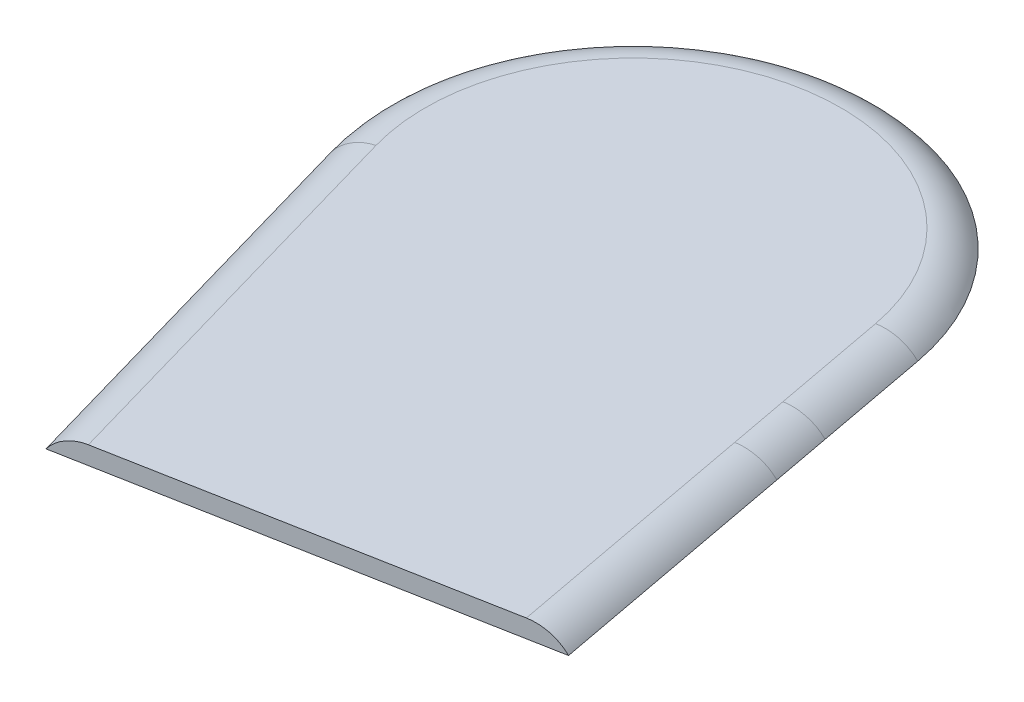
ISO-10303-21;
HEADER;
FILE_DESCRIPTION(('STEP AP214'),'2;1');
FILE_NAME('part.step','',(''),(''),'','','');
FILE_SCHEMA(('AUTOMOTIVE_DESIGN { 1 0 10303 214 1 1 1 1 }'));
ENDSEC;
DATA;
#1=APPLICATION_CONTEXT('core data for automotive mechanical design processes');
#2=APPLICATION_PROTOCOL_DEFINITION('international standard','automotive_design',2000,#1);
#3=PRODUCT_CONTEXT('',#1,'mechanical');
#4=PRODUCT('Part','Part','',(#3));
#5=PRODUCT_RELATED_PRODUCT_CATEGORY('part','',(#4));
#6=PRODUCT_DEFINITION_FORMATION('','',#4);
#7=PRODUCT_DEFINITION_CONTEXT('part definition',#1,'design');
#8=PRODUCT_DEFINITION('design','',#6,#7);
#9=PRODUCT_DEFINITION_SHAPE('','',#8);
#10=(LENGTH_UNIT() NAMED_UNIT(*) SI_UNIT(.MILLI.,.METRE.));
#11=(NAMED_UNIT(*) PLANE_ANGLE_UNIT() SI_UNIT($,.RADIAN.));
#12=(NAMED_UNIT(*) SI_UNIT($,.STERADIAN.) SOLID_ANGLE_UNIT());
#13=UNCERTAINTY_MEASURE_WITH_UNIT(LENGTH_MEASURE(1.E-05),#10,'distance_accuracy_value','');
#14=(GEOMETRIC_REPRESENTATION_CONTEXT(3) GLOBAL_UNCERTAINTY_ASSIGNED_CONTEXT((#13)) GLOBAL_UNIT_ASSIGNED_CONTEXT((#10,
#11,#12)) REPRESENTATION_CONTEXT('',''));
#15=CARTESIAN_POINT('',(0.,0.,0.));
#16=DIRECTION('',(0.,0.,1.));
#17=DIRECTION('',(1.,0.,0.));
#18=AXIS2_PLACEMENT_3D('',#15,#16,#17);
#19=CARTESIAN_POINT('',(6.95955180328218,2.,37.2237929405438));
#20=DIRECTION('',(-0.183780619914346,0.,-0.982967285184964));
#21=DIRECTION('',(-0.982967285184964,0.,0.183780619914346));
#22=AXIS2_PLACEMENT_3D('',#19,#20,#21);
#23=PLANE('',#22);
#24=DIRECTION('',(0.982967285184964,0.,-0.183780619914346));
#25=VECTOR('',#24,1.);
#26=CARTESIAN_POINT('',(6.95955180328218,2.,37.2237929405438));
#27=LINE('',#26,#25);
#28=CARTESIAN_POINT('',(-36.5925372365601,2.,45.3665155346136));
#29=VERTEX_POINT('',#28);
#30=CARTESIAN_POINT('',(4.24010560857998,2.,37.732234589639));
#31=VERTEX_POINT('',#30);
#32=EDGE_CURVE('E209',#29,#31,#27,.T.);
#33=ORIENTED_EDGE('',*,*,#32,.F.);
#34=CARTESIAN_POINT('',(-36.5925372365601,-3.,45.3665155346136));
#35=DIRECTION('',(-0.183780619914346,0.,-0.982967285184964));
#36=DIRECTION('',(0.982967285184964,0.,-0.183780619914346));
#37=AXIS2_PLACEMENT_3D('',#34,#35,#36);
#38=ELLIPSE('',#37,5.02220295891788,5.);
#39=CARTESIAN_POINT('',(-40.5418662031004,0.,46.104902393114));
#40=VERTEX_POINT('',#39);
#41=EDGE_CURVE('E11',#29,#40,#38,.F.);
#42=ORIENTED_EDGE('',*,*,#41,.T.);
#43=DIRECTION('',(0.982967285184964,0.,-0.183780619914346));
#44=VECTOR('',#43,1.);
#45=CARTESIAN_POINT('',(6.95955180328218,0.,37.2237929405438));
#46=LINE('',#45,#44);
#47=CARTESIAN_POINT('',(8.17197474931984,0.,36.9971121099817));
#48=VERTEX_POINT('',#47);
#49=EDGE_CURVE('E215',#40,#48,#46,.T.);
#50=ORIENTED_EDGE('',*,*,#49,.T.);
#51=CARTESIAN_POINT('',(4.24010560857998,-3.,37.732234589639));
#52=DIRECTION('',(-0.183780619914346,0.,-0.982967285184964));
#53=DIRECTION('',(-0.982967285184964,0.,0.183780619914346));
#54=AXIS2_PLACEMENT_3D('',#51,#52,#53);
#55=CIRCLE('',#54,5.);
#56=EDGE_CURVE('E55',#48,#31,#55,.F.);
#57=ORIENTED_EDGE('',*,*,#56,.T.);
#58=EDGE_LOOP('',(#33,#42,#50,#57));
#59=FACE_BOUND('',#58,.T.);
#60=ADVANCED_FACE('F41',(#59),#23,.F.);
#61=CARTESIAN_POINT('',(0.,2.,0.));
#62=DIRECTION('',(0.,1.,0.));
#63=DIRECTION('',(0.,0.,1.));
#64=AXIS2_PLACEMENT_3D('',#61,#62,#63);
#65=PLANE('',#64);
#66=CARTESIAN_POINT('',(-27.2546898028319,2.,-5.57131693130199));
#67=DIRECTION('',(0.,1.,0.));
#68=DIRECTION('',(0.,0.,1.));
#69=AXIS2_PLACEMENT_3D('',#66,#67,#68);
#70=CIRCLE('',#69,23.);
#71=CARTESIAN_POINT('',(-4.64648919049428,2.,-9.79852233356494));
#72=VERTEX_POINT('',#71);
#73=CARTESIAN_POINT('',(-49.365959954074,2.,0.760486310965284));
#74=VERTEX_POINT('',#73);
#75=EDGE_CURVE('E63',#72,#74,#70,.T.);
#76=ORIENTED_EDGE('',*,*,#75,.T.);
#77=DIRECTION('',(-0.275295793142056,0.,-0.961359571793138));
#78=VECTOR('',#77,1.);
#79=CARTESIAN_POINT('',(-36.6964279159278,2.,45.0037192205458));
#80=LINE('',#79,#78);
#81=EDGE_CURVE('E198',#74,#29,#80,.F.);
#82=ORIENTED_EDGE('',*,*,#81,.T.);
#83=ORIENTED_EDGE('',*,*,#32,.T.);
#84=DIRECTION('',(0.183780619914346,0.,0.982967285184964));
#85=VECTOR('',#84,1.);
#86=CARTESIAN_POINT('',(-1.06057125006859,2.,9.38108448568939));
#87=LINE('',#86,#85);
#88=CARTESIAN_POINT('',(-1.06052617980554,2.,9.38132554807198));
#89=VERTEX_POINT('',#88);
#90=EDGE_CURVE('E207',#31,#89,#87,.F.);
#91=ORIENTED_EDGE('',*,*,#90,.T.);
#92=DIRECTION('',(-0.183901118622884,0.,-0.982944748482463));
#93=VECTOR('',#92,1.);
#94=CARTESIAN_POINT('',(-2.28964895256604,2.,2.81170931202068));
#95=LINE('',#94,#93);
#96=CARTESIAN_POINT('',(-2.28971753360524,2.,2.81134274887613));
#97=VERTEX_POINT('',#96);
#98=EDGE_CURVE('E205',#89,#97,#95,.T.);
#99=ORIENTED_EDGE('',*,*,#98,.T.);
#100=DIRECTION('',(0.183717833856095,0.,0.982979021914112));
#101=VECTOR('',#100,1.);
#102=CARTESIAN_POINT('',(-4.64648919049428,2.,-9.79852233356495));
#103=LINE('',#102,#101);
#104=EDGE_CURVE('E68',#97,#72,#103,.F.);
#105=ORIENTED_EDGE('',*,*,#104,.T.);
#106=EDGE_LOOP('',(#76,#82,#83,#91,#99,#105));
#107=FACE_BOUND('',#106,.T.);
#108=ADVANCED_FACE('F152',(#107),#65,.T.);
#109=CARTESIAN_POINT('',(0.,0.,0.));
#110=DIRECTION('',(0.,1.,0.));
#111=DIRECTION('',(0.,0.,1.));
#112=AXIS2_PLACEMENT_3D('',#109,#110,#111);
#113=PLANE('',#112);
#114=DIRECTION('',(-0.183717833856095,0.,-0.982979021914112));
#115=VECTOR('',#114,1.);
#116=CARTESIAN_POINT('',(1.21177908505037,0.,-0.226480345617209));
#117=LINE('',#116,#115);
#118=CARTESIAN_POINT('',(1.64213004136381,0.,2.07610483752914));
#119=VERTEX_POINT('',#118);
#120=CARTESIAN_POINT('',(-0.714573102837832,0.,-10.5333936689893));
#121=VERTEX_POINT('',#120);
#122=EDGE_CURVE('E102',#119,#121,#117,.T.);
#123=ORIENTED_EDGE('',*,*,#122,.F.);
#124=DIRECTION('',(0.183901118622884,0.,0.982944748482463));
#125=VECTOR('',#124,1.);
#126=CARTESIAN_POINT('',(1.21130748397784,0.,-0.226625964118237));
#127=LINE('',#126,#125);
#128=CARTESIAN_POINT('',(2.87129789067127,0.,8.645962006032));
#129=VERTEX_POINT('',#128);
#130=EDGE_CURVE('E210',#119,#129,#127,.T.);
#131=ORIENTED_EDGE('',*,*,#130,.T.);
#132=DIRECTION('',(-0.183780619914346,0.,-0.982967285184964));
#133=VECTOR('',#132,1.);
#134=CARTESIAN_POINT('',(1.21242294603765,0.,-0.226680830562179));
#135=LINE('',#134,#133);
#136=EDGE_CURVE('E212',#48,#129,#135,.T.);
#137=ORIENTED_EDGE('',*,*,#136,.F.);
#138=ORIENTED_EDGE('',*,*,#49,.F.);
#139=DIRECTION('',(0.275295793142056,0.,0.961359571793138));
#140=VECTOR('',#139,1.);
#141=CARTESIAN_POINT('',(-49.6713310117158,0.,14.2239271012681));
#142=LINE('',#141,#140);
#143=CARTESIAN_POINT('',(-53.2113982412466,0.,1.8616694835335));
#144=VERTEX_POINT('',#143);
#145=EDGE_CURVE('E106',#144,#40,#142,.T.);
#146=ORIENTED_EDGE('',*,*,#145,.F.);
#147=CARTESIAN_POINT('',(-27.2546898028319,0.,-5.57131693130199));
#148=DIRECTION('',(0.,1.,0.));
#149=DIRECTION('',(0.,0.,1.));
#150=AXIS2_PLACEMENT_3D('',#147,#148,#149);
#151=CIRCLE('',#150,27.);
#152=EDGE_CURVE('E99',#121,#144,#151,.T.);
#153=ORIENTED_EDGE('',*,*,#152,.F.);
#154=EDGE_LOOP('',(#123,#131,#137,#138,#146,#153));
#155=FACE_BOUND('',#154,.T.);
#156=ADVANCED_FACE('F101',(#155),#113,.F.);
#157=CARTESIAN_POINT('',(-2.7194461947022,-3.,0.508441649095207));
#158=DIRECTION('',(-0.183780619914346,0.,-0.982967285184964));
#159=DIRECTION('',(-0.982967285184964,0.,0.183780619914346));
#160=AXIS2_PLACEMENT_3D('',#157,#158,#159);
#161=CYLINDRICAL_SURFACE('',#160,5.);
#162=ORIENTED_EDGE('',*,*,#56,.F.);
#163=ORIENTED_EDGE('',*,*,#136,.T.);
#164=CARTESIAN_POINT('',(2.87129789067127,0.,8.645962006032));
#165=CARTESIAN_POINT('',(2.54247151599969,0.454027256149872,8.70746193636732));
#166=CARTESIAN_POINT('',(2.13367977658871,0.843504698106141,8.78391767542));
#167=CARTESIAN_POINT('',(1.22123880720503,1.46104070328188,8.95457021540722));
#168=CARTESIAN_POINT('',(0.719312689397859,1.69172046094786,9.0484447451181));
#169=CARTESIAN_POINT('',(-0.214185688318685,1.9452146147611,9.22303562231111));
#170=CARTESIAN_POINT('',(-0.637004898012303,2.00255033916051,9.30211489922968));
#171=CARTESIAN_POINT('',(-1.06052619145423,2.,9.38132548587561));
#172=B_SPLINE_CURVE_WITH_KNOTS('',3,(#164,#165,#166,#167,#168,#169,#170,#171),.UNSPECIFIED.,.F.,
.F.,(4,2,2,4),(0.,1.67885686252806,3.32929060178356,4.6173133726065),.UNSPECIFIED.);
#173=EDGE_CURVE('E46',#89,#129,#172,.F.);
#174=ORIENTED_EDGE('',*,*,#173,.F.);
#175=ORIENTED_EDGE('',*,*,#90,.F.);
#176=EDGE_LOOP('',(#162,#163,#174,#175));
#177=FACE_BOUND('',#176,.T.);
#178=ADVANCED_FACE('F43',(#177),#161,.T.);
#179=CARTESIAN_POINT('',(-2.72047150995201,-3.,0.508978510373301));
#180=DIRECTION('',(0.183901118622884,0.,0.982944748482463));
#181=DIRECTION('',(0.982944748482463,0.,-0.183901118622884));
#182=AXIS2_PLACEMENT_3D('',#179,#180,#181);
#183=CYLINDRICAL_SURFACE('',#182,5.);
#184=ORIENTED_EDGE('',*,*,#173,.T.);
#185=ORIENTED_EDGE('',*,*,#130,.F.);
#186=CARTESIAN_POINT('',(1.64213004136381,0.,2.07610483752914));
#187=CARTESIAN_POINT('',(1.55925089387341,0.112446506082964,2.09160286742842));
#188=CARTESIAN_POINT('',(1.47169271798087,0.221313828609221,2.10797585471325));
#189=CARTESIAN_POINT('',(1.28801227665004,0.431022562094104,2.14232327572975));
#190=CARTESIAN_POINT('',(1.19190213852997,0.531874966127541,2.16029544170715));
#191=CARTESIAN_POINT('',(0.991500701657677,0.725173959859929,2.19776961411662));
#192=CARTESIAN_POINT('',(0.887195326217818,0.817605470228611,2.21727425282634));
#193=CARTESIAN_POINT('',(0.725220406842878,0.949333437308392,2.24756283830869));
#194=CARTESIAN_POINT('',(0.670272159212454,0.992114836268448,2.2578379148535));
#195=CARTESIAN_POINT('',(0.558650630613196,1.07530643457134,2.27871064147111));
#196=CARTESIAN_POINT('',(0.501975936172419,1.11571460710816,2.28930855585685));
#197=CARTESIAN_POINT('',(-0.0132097967326585,1.46635662549974,2.38564598376323));
#198=CARTESIAN_POINT('',(-0.5283859906894,1.70114604863241,2.48198162789463));
#199=CARTESIAN_POINT('',(-1.13133099499757,1.85972220288003,2.59472964702752));
#200=CARTESIAN_POINT('',(-1.20136942115489,1.87644437640249,2.60782651947214));
#201=CARTESIAN_POINT('',(-1.60525983389751,1.96327436218554,2.68335222025647));
#202=CARTESIAN_POINT('',(-1.9453126972226,1.99892298088139,2.74694058481668));
#203=CARTESIAN_POINT('',(-2.28971753360388,2.,2.81134274887406));
#204=B_SPLINE_CURVE_WITH_KNOTS('',3,(#186,#187,#188,#189,#190,#191,#192,#193,#194,#195,#196,
#197,#198,#199,#200,#201,#202,#203),.UNSPECIFIED.,.F.,.F.,(4,2,2,2,2,2,2,2,4),(0.,
0.42150113654036,0.842413799380723,1.26406595667249,1.47516384222731,1.68643946576254,
3.36529633154478,3.58484485198346,4.6261731746632),.UNSPECIFIED.);
#205=EDGE_CURVE('E116',#97,#119,#204,.F.);
#206=ORIENTED_EDGE('',*,*,#205,.F.);
#207=ORIENTED_EDGE('',*,*,#98,.F.);
#208=EDGE_LOOP('',(#184,#185,#206,#207));
#209=FACE_BOUND('',#208,.T.);
#210=ADVANCED_FACE('F137',(#209),#183,.T.);
#211=CARTESIAN_POINT('',(-2.72013700260608,-3.,0.508390989807171));
#212=DIRECTION('',(-0.183717833856095,0.,-0.982979021914112));
#213=DIRECTION('',(-0.982979021914112,0.,0.183717833856095));
#214=AXIS2_PLACEMENT_3D('',#211,#212,#213);
#215=CYLINDRICAL_SURFACE('',#214,5.);
#216=ORIENTED_EDGE('',*,*,#205,.T.);
#217=ORIENTED_EDGE('',*,*,#122,.T.);
#218=CARTESIAN_POINT('',(-0.714573102837833,0.,-10.5333936689893));
#219=CARTESIAN_POINT('',(-0.771540048237213,0.0772767756746297,-10.5227466016798));
#220=CARTESIAN_POINT('',(-0.830713148188878,0.152869861167736,-10.5116872062061));
#221=CARTESIAN_POINT('',(-0.953261827189217,0.30044437868484,-10.4887829759571));
#222=CARTESIAN_POINT('',(-1.01663740623789,0.372425810708839,-10.4769381411817));
#223=CARTESIAN_POINT('',(-1.14738121342468,0.51253274818167,-10.4525022493559));
#224=CARTESIAN_POINT('',(-1.21474944156281,0.580658253630503,-10.4399111923055));
#225=CARTESIAN_POINT('',(-1.35325152857102,0.712825262488178,-10.4140252854424));
#226=CARTESIAN_POINT('',(-1.42438538744111,0.77686676589702,-10.4007304356296));
#227=CARTESIAN_POINT('',(-1.57018008592409,0.900650538357035,-10.3734815466951));
#228=CARTESIAN_POINT('',(-1.64484092553698,0.960392807408207,-10.3595275075735));
#229=CARTESIAN_POINT('',(-1.79743882060332,1.07537754878077,-10.3310071077403));
#230=CARTESIAN_POINT('',(-1.87537587605676,1.13062002110216,-10.3164407470288));
#231=CARTESIAN_POINT('',(-2.03426450927057,1.23641965419375,-10.2867446142857));
#232=CARTESIAN_POINT('',(-2.11521608703092,1.28697681496394,-10.2716148422541));
#233=CARTESIAN_POINT('',(-2.27986192920407,1.38323606006865,-10.2408426926933));
#234=CARTESIAN_POINT('',(-2.36355619361686,1.42893814440317,-10.2252003151641));
#235=CARTESIAN_POINT('',(-2.53340636888082,1.51533376987974,-10.1934554807536));
#236=CARTESIAN_POINT('',(-2.61956227973199,1.55602731102179,-10.1773530238724));
#237=CARTESIAN_POINT('',(-2.79404644006203,1.6322692048685,-10.1447421021097));
#238=CARTESIAN_POINT('',(-2.88237468954089,1.66781755757316,-10.1282336372281));
#239=CARTESIAN_POINT('',(-3.06090692547733,1.73364969933126,-10.0948661340276));
#240=CARTESIAN_POINT('',(-3.15111091193491,1.76393348838468,-10.0780070957086));
#241=CARTESIAN_POINT('',(-3.33309171996622,1.8191348317797,-10.0439950577001));
#242=CARTESIAN_POINT('',(-3.42486854153996,1.84405238612128,-10.0268420580105));
#243=CARTESIAN_POINT('',(-3.6096868419786,1.88843751185714,-9.99229969539994));
#244=CARTESIAN_POINT('',(-3.7027283208435,1.90790508325142,-9.97491033247889));
#245=CARTESIAN_POINT('',(-3.88976349078834,1.94132515657766,-9.93995363908955));
#246=CARTESIAN_POINT('',(-3.98375718186829,1.95527765850962,-9.92238630862126));
#247=CARTESIAN_POINT('',(-4.17238121051077,1.9776196787178,-9.88713265906935));
#248=CARTESIAN_POINT('',(-4.26701154807332,1.98600919699403,-9.86944633998573));
#249=CARTESIAN_POINT('',(-4.45659087940532,1.99720104306478,-9.83401414527988));
#250=CARTESIAN_POINT('',(-4.55153987317478,2.00000337085931,-9.81626826965764));
#251=CARTESIAN_POINT('',(-4.64648919990986,2.,-9.79852233180445));
#252=B_SPLINE_CURVE_WITH_KNOTS('',3,(#218,#219,#220,#221,#222,#223,#224,#225,#226,#227,#228,
#229,#230,#231,#232,#233,#234,#235,#236,#237,#238,#239,#240,#241,#242,#243,#244,#245,#246,#247,
#248,#249,#250,#251),.UNSPECIFIED.,.F.,.F.,(4,2,2,2,2,2,2,2,2,2,2,2,2,2,2,2,4),(0.,
0.28973920213578,0.579478404271559,0.869217606407341,1.15895680854312,1.4486960106789,
1.73843521281468,2.02817441495046,2.31791361708624,2.60765281922202,2.8973920213578,
3.18713122349358,3.47687042562936,3.76660962776514,4.05634882990092,4.3460880320367,
4.63582723417248),.UNSPECIFIED.);
#253=EDGE_CURVE('E114',#72,#121,#252,.F.);
#254=ORIENTED_EDGE('',*,*,#253,.F.);
#255=ORIENTED_EDGE('',*,*,#104,.F.);
#256=EDGE_LOOP('',(#216,#217,#254,#255));
#257=FACE_BOUND('',#256,.T.);
#258=ADVANCED_FACE('F113',(#257),#215,.T.);
#259=CARTESIAN_POINT('',(-27.2546898028319,-3.,-5.57131693130199));
#260=DIRECTION('',(0.,-1.,0.));
#261=DIRECTION('',(0.,0.,-1.));
#262=AXIS2_PLACEMENT_3D('',#259,#260,#261);
#263=TOROIDAL_SURFACE('',#262,23.,5.);
#264=ORIENTED_EDGE('',*,*,#253,.T.);
#265=ORIENTED_EDGE('',*,*,#152,.T.);
#266=CARTESIAN_POINT('',(-49.365959954074,-3.,0.760486310965284));
#267=DIRECTION('',(0.275295793142055,0.,0.961359571793139));
#268=DIRECTION('',(0.961359571793139,0.,-0.275295793142055));
#269=AXIS2_PLACEMENT_3D('',#266,#267,#268);
#270=CIRCLE('',#269,5.);
#271=EDGE_CURVE('E119',#74,#144,#270,.T.);
#272=ORIENTED_EDGE('',*,*,#271,.F.);
#273=ORIENTED_EDGE('',*,*,#75,.F.);
#274=EDGE_LOOP('',(#264,#265,#272,#273));
#275=FACE_BOUND('',#274,.T.);
#276=ADVANCED_FACE('F118',(#275),#263,.T.);
#277=CARTESIAN_POINT('',(-45.8258927245432,-3.,13.1227439286998));
#278=DIRECTION('',(0.275295793142056,0.,0.961359571793138));
#279=DIRECTION('',(0.961359571793138,0.,-0.275295793142056));
#280=AXIS2_PLACEMENT_3D('',#277,#278,#279);
#281=CYLINDRICAL_SURFACE('',#280,5.);
#282=ORIENTED_EDGE('',*,*,#271,.T.);
#283=ORIENTED_EDGE('',*,*,#145,.T.);
#284=ORIENTED_EDGE('',*,*,#41,.F.);
#285=ORIENTED_EDGE('',*,*,#81,.F.);
#286=EDGE_LOOP('',(#282,#283,#284,#285));
#287=FACE_BOUND('',#286,.T.);
#288=ADVANCED_FACE('F138',(#287),#281,.T.);
#289=CLOSED_SHELL('',(#60,#108,#156,#178,#210,#258,#276,#288));
#290=MANIFOLD_SOLID_BREP('B2',#289);
#291=ADVANCED_BREP_SHAPE_REPRESENTATION('',(#18,#290),#14);
#292=SHAPE_DEFINITION_REPRESENTATION(#9,#291);
ENDSEC;
END-ISO-10303-21;
